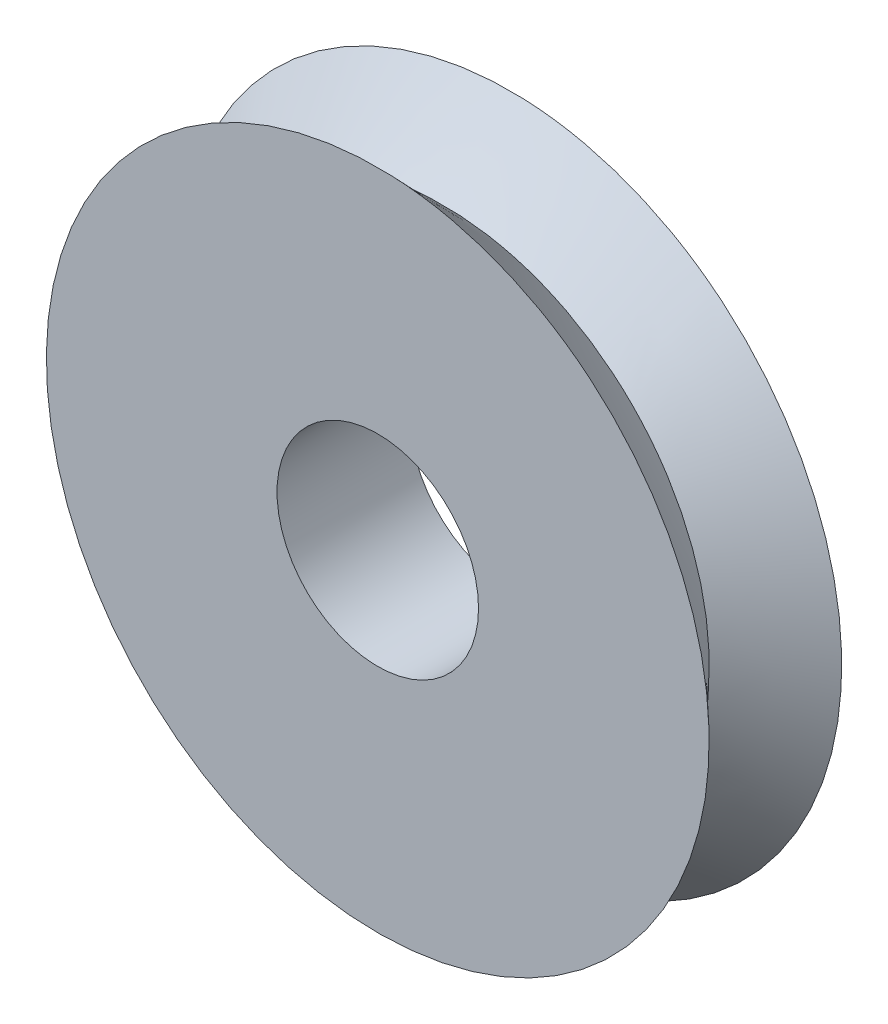
ISO-10303-21;
HEADER;
FILE_DESCRIPTION(('STEP AP214'),'2;1');
FILE_NAME('part.step','',(''),(''),'','','');
FILE_SCHEMA(('AUTOMOTIVE_DESIGN { 1 0 10303 214 1 1 1 1 }'));
ENDSEC;
DATA;
#1=APPLICATION_CONTEXT('core data for automotive mechanical design processes');
#2=APPLICATION_PROTOCOL_DEFINITION('international standard','automotive_design',2000,#1);
#3=PRODUCT_CONTEXT('',#1,'mechanical');
#4=PRODUCT('Part','Part','',(#3));
#5=PRODUCT_RELATED_PRODUCT_CATEGORY('part','',(#4));
#6=PRODUCT_DEFINITION_FORMATION('','',#4);
#7=PRODUCT_DEFINITION_CONTEXT('part definition',#1,'design');
#8=PRODUCT_DEFINITION('design','',#6,#7);
#9=PRODUCT_DEFINITION_SHAPE('','',#8);
#10=(LENGTH_UNIT() NAMED_UNIT(*) SI_UNIT(.MILLI.,.METRE.));
#11=(NAMED_UNIT(*) PLANE_ANGLE_UNIT() SI_UNIT($,.RADIAN.));
#12=(NAMED_UNIT(*) SI_UNIT($,.STERADIAN.) SOLID_ANGLE_UNIT());
#13=UNCERTAINTY_MEASURE_WITH_UNIT(LENGTH_MEASURE(1.E-05),#10,'distance_accuracy_value','');
#14=(GEOMETRIC_REPRESENTATION_CONTEXT(3) GLOBAL_UNCERTAINTY_ASSIGNED_CONTEXT((#13)) GLOBAL_UNIT_ASSIGNED_CONTEXT((#10,
#11,#12)) REPRESENTATION_CONTEXT('',''));
#15=CARTESIAN_POINT('',(0.,0.,0.));
#16=DIRECTION('',(0.,0.,1.));
#17=DIRECTION('',(1.,0.,0.));
#18=AXIS2_PLACEMENT_3D('',#15,#16,#17);
#19=CARTESIAN_POINT('',(0.,0.,1.));
#20=DIRECTION('',(0.,0.,1.));
#21=DIRECTION('',(1.,0.,0.));
#22=AXIS2_PLACEMENT_3D('',#19,#20,#21);
#23=PLANE('',#22);
#24=CARTESIAN_POINT('',(0.,0.,1.));
#25=DIRECTION('',(0.,0.,1.));
#26=DIRECTION('',(1.,0.,0.));
#27=AXIS2_PLACEMENT_3D('',#24,#25,#26);
#28=CIRCLE('',#27,1.52);
#29=CARTESIAN_POINT('',(1.52,0.,1.));
#30=VERTEX_POINT('',#29);
#31=EDGE_CURVE('E56',#30,#30,#28,.T.);
#32=ORIENTED_EDGE('',*,*,#31,.F.);
#33=EDGE_LOOP('',(#32));
#34=FACE_BOUND('',#33,.T.);
#35=CARTESIAN_POINT('',(0.,0.,1.));
#36=DIRECTION('',(0.,0.,1.));
#37=DIRECTION('',(1.,0.,0.));
#38=AXIS2_PLACEMENT_3D('',#35,#36,#37);
#39=CIRCLE('',#38,5.);
#40=CARTESIAN_POINT('',(-1.79672698002946,-4.66602316316949,1.));
#41=VERTEX_POINT('',#40);
#42=EDGE_CURVE('E11',#41,#41,#39,.T.);
#43=ORIENTED_EDGE('',*,*,#42,.T.);
#44=EDGE_LOOP('',(#43));
#45=FACE_BOUND('',#44,.T.);
#46=ADVANCED_FACE('F41',(#34,#45),#23,.T.);
#47=CARTESIAN_POINT('',(-2.20658348251373,-3.33631373445268,0.));
#48=CARTESIAN_POINT('',(-1.79672698002946,-4.66602316316949,1.));
#49=CARTESIAN_POINT('',(4.46604398639164,-7.74948069948013,0.));
#50=CARTESIAN_POINT('',(7.53531934630953,-8.2594771232284,1.));
#51=CARTESIAN_POINT('',(8.87921095141909,-1.07685323057477,0.));
#52=CARTESIAN_POINT('',(11.1287733063684,1.07256920311058,1.));
#53=CARTESIAN_POINT('',(2.20658348251372,3.33631373445268,0.));
#54=CARTESIAN_POINT('',(1.79672698002945,4.66602316316949,1.));
#55=CARTESIAN_POINT('',(-4.46604398639164,7.74948069948013,0.));
#56=CARTESIAN_POINT('',(-7.53531934630953,8.2594771232284,1.));
#57=CARTESIAN_POINT('',(-8.87921095141909,1.07685323057477,0.));
#58=CARTESIAN_POINT('',(-11.1287733063684,-1.07256920311058,1.));
#59=CARTESIAN_POINT('',(-2.20658348251373,-3.33631373445268,0.));
#60=CARTESIAN_POINT('',(-1.79672698002946,-4.66602316316949,1.));
#61=(BOUNDED_SURFACE() B_SPLINE_SURFACE(3,1,((#47,#48),(#49,#50),(#51,#52),(#53,#54),(#55,#56),
(#57,#58),(#59,#60)),.UNSPECIFIED.,.T.,.F.,.F.) B_SPLINE_SURFACE_WITH_KNOTS((4,3,4),(2,2),(0.,
0.5,1.),(0.,1.),.UNSPECIFIED.) GEOMETRIC_REPRESENTATION_ITEM() RATIONAL_B_SPLINE_SURFACE(((1.,
1.),(0.333333333333333,0.333333333333333),(0.333333333333333,0.333333333333333),(1.,1.),
(0.333333333333333,0.333333333333333),(0.333333333333333,0.333333333333333),(1.,1.))) REPRESENTATION_ITEM('') SURFACE());
#62=CARTESIAN_POINT('',(0.,0.,0.));
#63=DIRECTION('',(0.,0.,1.));
#64=DIRECTION('',(1.,0.,0.));
#65=AXIS2_PLACEMENT_3D('',#62,#63,#64);
#66=CIRCLE('',#65,4.);
#67=CARTESIAN_POINT('',(-2.20658348251373,-3.33631373445268,0.));
#68=VERTEX_POINT('',#67);
#69=EDGE_CURVE('E51',#68,#68,#66,.T.);
#70=CARTESIAN_POINT('',(-2.20658348251373,-3.33631373445268,0.));
#71=CARTESIAN_POINT('',(-2.20231414394618,-3.35016487433515,0.0104166666666666));
#72=CARTESIAN_POINT('',(-2.19804480537864,-3.36401601421762,0.0208333333333333));
#73=CARTESIAN_POINT('',(-2.18950612824355,-3.39171829398255,0.0416666666666667));
#74=CARTESIAN_POINT('',(-2.185236789676,-3.40556943386502,0.0520833333333334));
#75=CARTESIAN_POINT('',(-2.17669811254091,-3.43327171362995,0.0729166666666667));
#76=CARTESIAN_POINT('',(-2.17242877397337,-3.44712285351242,0.0833333333333333));
#77=CARTESIAN_POINT('',(-2.16389009683828,-3.47482513327735,0.104166666666667));
#78=CARTESIAN_POINT('',(-2.15962075827074,-3.48867627315982,0.114583333333333));
#79=CARTESIAN_POINT('',(-2.15108208113565,-3.51637855292475,0.135416666666667));
#80=CARTESIAN_POINT('',(-2.1468127425681,-3.53022969280722,0.145833333333333));
#81=CARTESIAN_POINT('',(-2.13827406543301,-3.55793197257215,0.166666666666667));
#82=CARTESIAN_POINT('',(-2.13400472686547,-3.57178311245462,0.177083333333333));
#83=CARTESIAN_POINT('',(-2.12546604973038,-3.59948539221955,0.197916666666667));
#84=CARTESIAN_POINT('',(-2.12119671116284,-3.61333653210202,0.208333333333333));
#85=CARTESIAN_POINT('',(-2.11265803402775,-3.64103881186695,0.229166666666667));
#86=CARTESIAN_POINT('',(-2.1083886954602,-3.65488995174942,0.239583333333333));
#87=CARTESIAN_POINT('',(-2.09985001832511,-3.68259223151435,0.260416666666667));
#88=CARTESIAN_POINT('',(-2.09558067975757,-3.69644337139682,0.270833333333333));
#89=CARTESIAN_POINT('',(-2.08704200262248,-3.72414565116175,0.291666666666667));
#90=CARTESIAN_POINT('',(-2.08277266405494,-3.73799679104422,0.302083333333333));
#91=CARTESIAN_POINT('',(-2.07423398691985,-3.76569907080915,0.322916666666667));
#92=CARTESIAN_POINT('',(-2.0699646483523,-3.77955021069162,0.333333333333333));
#93=CARTESIAN_POINT('',(-2.06142597121721,-3.80725249045655,0.354166666666667));
#94=CARTESIAN_POINT('',(-2.05715663264967,-3.82110363033902,0.364583333333333));
#95=CARTESIAN_POINT('',(-2.04861795551458,-3.84880591010395,0.385416666666667));
#96=CARTESIAN_POINT('',(-2.04434861694704,-3.86265704998642,0.395833333333333));
#97=CARTESIAN_POINT('',(-2.03580993981195,-3.89035932975135,0.416666666666667));
#98=CARTESIAN_POINT('',(-2.0315406012444,-3.90421046963382,0.427083333333333));
#99=CARTESIAN_POINT('',(-2.02300192410931,-3.93191274939875,0.447916666666667));
#100=CARTESIAN_POINT('',(-2.01873258554177,-3.94576388928122,0.458333333333333));
#101=CARTESIAN_POINT('',(-2.01019390840668,-3.97346616904615,0.479166666666667));
#102=CARTESIAN_POINT('',(-2.00592456983913,-3.98731730892862,0.489583333333333));
#103=CARTESIAN_POINT('',(-1.99738589270405,-4.01501958869355,0.510416666666667));
#104=CARTESIAN_POINT('',(-1.9931165541365,-4.02887072857602,0.520833333333333));
#105=CARTESIAN_POINT('',(-1.98457787700141,-4.05657300834095,0.541666666666667));
#106=CARTESIAN_POINT('',(-1.98030853843387,-4.07042414822342,0.552083333333333));
#107=CARTESIAN_POINT('',(-1.97176986129878,-4.09812642798835,0.572916666666667));
#108=CARTESIAN_POINT('',(-1.96750052273123,-4.11197756787082,0.583333333333333));
#109=CARTESIAN_POINT('',(-1.95896184559615,-4.13967984763575,0.604166666666667));
#110=CARTESIAN_POINT('',(-1.9546925070286,-4.15353098751822,0.614583333333333));
#111=CARTESIAN_POINT('',(-1.94615382989351,-4.18123326728316,0.635416666666667));
#112=CARTESIAN_POINT('',(-1.94188449132597,-4.19508440716562,0.645833333333333));
#113=CARTESIAN_POINT('',(-1.93334581419088,-4.22278668693056,0.666666666666667));
#114=CARTESIAN_POINT('',(-1.92907647562333,-4.23663782681302,0.677083333333333));
#115=CARTESIAN_POINT('',(-1.92053779848825,-4.26434010657796,0.697916666666667));
#116=CARTESIAN_POINT('',(-1.9162684599207,-4.27819124646042,0.708333333333333));
#117=CARTESIAN_POINT('',(-1.90772978278561,-4.30589352622536,0.729166666666667));
#118=CARTESIAN_POINT('',(-1.90346044421807,-4.31974466610782,0.739583333333333));
#119=CARTESIAN_POINT('',(-1.89492176708298,-4.34744694587276,0.760416666666667));
#120=CARTESIAN_POINT('',(-1.89065242851543,-4.36129808575522,0.770833333333333));
#121=CARTESIAN_POINT('',(-1.88211375138034,-4.38900036552016,0.791666666666667));
#122=CARTESIAN_POINT('',(-1.8778444128128,-4.40285150540262,0.802083333333333));
#123=CARTESIAN_POINT('',(-1.86930573567771,-4.43055378516756,0.822916666666667));
#124=CARTESIAN_POINT('',(-1.86503639711017,-4.44440492505002,0.833333333333333));
#125=CARTESIAN_POINT('',(-1.85649771997508,-4.47210720481496,0.854166666666667));
#126=CARTESIAN_POINT('',(-1.85222838140753,-4.48595834469742,0.864583333333333));
#127=CARTESIAN_POINT('',(-1.84368970427244,-4.51366062446236,0.885416666666667));
#128=CARTESIAN_POINT('',(-1.8394203657049,-4.52751176434482,0.895833333333333));
#129=CARTESIAN_POINT('',(-1.83088168856981,-4.55521404410976,0.916666666666667));
#130=CARTESIAN_POINT('',(-1.82661235000227,-4.56906518399223,0.927083333333333));
#131=CARTESIAN_POINT('',(-1.81807367286718,-4.59676746375716,0.947916666666667));
#132=CARTESIAN_POINT('',(-1.81380433429963,-4.61061860363963,0.958333333333333));
#133=CARTESIAN_POINT('',(-1.80526565716454,-4.63832088340456,0.979166666666667));
#134=CARTESIAN_POINT('',(-1.800996318597,-4.65217202328702,0.989583333333333));
#135=CARTESIAN_POINT('',(-1.79672698002946,-4.66602316316949,1.));
#136=B_SPLINE_CURVE_WITH_KNOTS('',3,(#70,#71,#72,#73,#74,#75,#76,#77,#78,#79,#80,#81,#82,#83,
#84,#85,#86,#87,#88,#89,#90,#91,#92,#93,#94,#95,#96,#97,#98,#99,#100,#101,#102,#103,#104,#105,
#106,#107,#108,#109,#110,#111,#112,#113,#114,#115,#116,#117,#118,#119,#120,#121,#122,#123,#124,
#125,#126,#127,#128,#129,#130,#131,#132,#133,#134,#135),.UNSPECIFIED.,.F.,.F.,(4,2,2,2,2,2,2,2,
2,2,2,2,2,2,2,2,2,2,2,2,2,2,2,2,2,2,2,2,2,2,2,2,4),(0.,0.0535471236448033,0.107094247289607,
0.16064137093441,0.214188494579213,0.267735618224017,0.32128274186882,0.374829865513623,
0.428376989158427,0.48192411280323,0.535471236448033,0.589018360092837,0.64256548373764,
0.696112607382443,0.749659731027247,0.80320685467205,0.856753978316853,0.910301101961657,
0.96384822560646,1.01739534925126,1.07094247289607,1.12448959654087,1.17803672018567,
1.23158384383048,1.28513096747528,1.33867809112008,1.39222521476489,1.44577233840969,
1.49931946205449,1.5528665856993,1.6064137093441,1.6599608329889,1.71350795663371),.UNSPECIFIED.);
#137=EDGE_CURVE('BSEAM67',#68,#41,#136,.T.);
#138=ORIENTED_EDGE('',*,*,#69,.T.);
#139=ORIENTED_EDGE('',*,*,#42,.F.);
#140=ORIENTED_EDGE('',*,*,#137,.T.);
#141=ORIENTED_EDGE('',*,*,#137,.F.);
#142=EDGE_LOOP('',(#138,#140,#139,#141));
#143=FACE_BOUND('',#142,.T.);
#144=ADVANCED_FACE('F67',(#143),#61,.T.);
#145=CARTESIAN_POINT('',(0.,0.,-1.));
#146=DIRECTION('',(0.,0.,-1.));
#147=DIRECTION('',(1.,0.,0.));
#148=AXIS2_PLACEMENT_3D('',#145,#146,#147);
#149=PLANE('',#148);
#150=CARTESIAN_POINT('',(0.,0.,-1.));
#151=DIRECTION('',(0.,0.,-1.));
#152=DIRECTION('',(-1.,0.,0.));
#153=AXIS2_PLACEMENT_3D('',#150,#151,#152);
#154=CIRCLE('',#153,1.52);
#155=CARTESIAN_POINT('',(-1.52,0.,-1.));
#156=VERTEX_POINT('',#155);
#157=EDGE_CURVE('E58',#156,#156,#154,.F.);
#158=ORIENTED_EDGE('',*,*,#157,.T.);
#159=EDGE_LOOP('',(#158));
#160=FACE_BOUND('',#159,.T.);
#161=CARTESIAN_POINT('',(0.,0.,-1.));
#162=DIRECTION('',(0.,0.,1.));
#163=DIRECTION('',(1.,0.,0.));
#164=AXIS2_PLACEMENT_3D('',#161,#162,#163);
#165=CIRCLE('',#164,5.);
#166=CARTESIAN_POINT('',(-1.79672698002946,-4.66602316316949,-1.));
#167=VERTEX_POINT('',#166);
#168=EDGE_CURVE('E47',#167,#167,#165,.T.);
#169=ORIENTED_EDGE('',*,*,#168,.F.);
#170=EDGE_LOOP('',(#169));
#171=FACE_BOUND('',#170,.T.);
#172=ADVANCED_FACE('F73',(#160,#171),#149,.T.);
#173=CARTESIAN_POINT('',(-2.20658348251373,-3.33631373445268,0.));
#174=CARTESIAN_POINT('',(-1.79672698002946,-4.66602316316949,-1.));
#175=CARTESIAN_POINT('',(4.46604398639164,-7.74948069948013,0.));
#176=CARTESIAN_POINT('',(7.53531934630953,-8.2594771232284,-1.));
#177=CARTESIAN_POINT('',(8.87921095141909,-1.07685323057477,0.));
#178=CARTESIAN_POINT('',(11.1287733063684,1.07256920311058,-1.));
#179=CARTESIAN_POINT('',(2.20658348251372,3.33631373445268,0.));
#180=CARTESIAN_POINT('',(1.79672698002945,4.66602316316949,-1.));
#181=CARTESIAN_POINT('',(-4.46604398639164,7.74948069948013,0.));
#182=CARTESIAN_POINT('',(-7.53531934630953,8.2594771232284,-1.));
#183=CARTESIAN_POINT('',(-8.87921095141909,1.07685323057477,0.));
#184=CARTESIAN_POINT('',(-11.1287733063684,-1.07256920311058,-1.));
#185=CARTESIAN_POINT('',(-2.20658348251373,-3.33631373445268,0.));
#186=CARTESIAN_POINT('',(-1.79672698002946,-4.66602316316949,-1.));
#187=(BOUNDED_SURFACE() B_SPLINE_SURFACE(3,1,((#173,#174),(#175,#176),(#177,#178),(#179,#180),
(#181,#182),(#183,#184),(#185,#186)),.UNSPECIFIED.,.T.,.F.,.F.) B_SPLINE_SURFACE_WITH_KNOTS((4,
3,4),(2,2),(0.,0.5,1.),(0.,1.),
.UNSPECIFIED.) GEOMETRIC_REPRESENTATION_ITEM() RATIONAL_B_SPLINE_SURFACE(((1.,1.),
(0.333333333333333,0.333333333333333),(0.333333333333333,0.333333333333333),(1.,1.),
(0.333333333333333,0.333333333333333),(0.333333333333333,0.333333333333333),(1.,1.))) REPRESENTATION_ITEM('') SURFACE());
#188=CARTESIAN_POINT('',(-2.20658348251373,-3.33631373445268,0.));
#189=CARTESIAN_POINT('',(-2.20231414394618,-3.35016487433515,-0.0104166666666666));
#190=CARTESIAN_POINT('',(-2.19804480537864,-3.36401601421762,-0.0208333333333333));
#191=CARTESIAN_POINT('',(-2.18950612824355,-3.39171829398255,-0.0416666666666667));
#192=CARTESIAN_POINT('',(-2.185236789676,-3.40556943386502,-0.0520833333333334));
#193=CARTESIAN_POINT('',(-2.17669811254091,-3.43327171362995,-0.0729166666666667));
#194=CARTESIAN_POINT('',(-2.17242877397337,-3.44712285351242,-0.0833333333333333));
#195=CARTESIAN_POINT('',(-2.16389009683828,-3.47482513327735,-0.104166666666667));
#196=CARTESIAN_POINT('',(-2.15962075827074,-3.48867627315982,-0.114583333333333));
#197=CARTESIAN_POINT('',(-2.15108208113565,-3.51637855292475,-0.135416666666667));
#198=CARTESIAN_POINT('',(-2.1468127425681,-3.53022969280722,-0.145833333333333));
#199=CARTESIAN_POINT('',(-2.13827406543301,-3.55793197257215,-0.166666666666667));
#200=CARTESIAN_POINT('',(-2.13400472686547,-3.57178311245462,-0.177083333333333));
#201=CARTESIAN_POINT('',(-2.12546604973038,-3.59948539221955,-0.197916666666667));
#202=CARTESIAN_POINT('',(-2.12119671116284,-3.61333653210202,-0.208333333333333));
#203=CARTESIAN_POINT('',(-2.11265803402775,-3.64103881186695,-0.229166666666667));
#204=CARTESIAN_POINT('',(-2.1083886954602,-3.65488995174942,-0.239583333333333));
#205=CARTESIAN_POINT('',(-2.09985001832511,-3.68259223151435,-0.260416666666667));
#206=CARTESIAN_POINT('',(-2.09558067975757,-3.69644337139682,-0.270833333333333));
#207=CARTESIAN_POINT('',(-2.08704200262248,-3.72414565116175,-0.291666666666667));
#208=CARTESIAN_POINT('',(-2.08277266405494,-3.73799679104422,-0.302083333333333));
#209=CARTESIAN_POINT('',(-2.07423398691985,-3.76569907080915,-0.322916666666667));
#210=CARTESIAN_POINT('',(-2.0699646483523,-3.77955021069162,-0.333333333333333));
#211=CARTESIAN_POINT('',(-2.06142597121721,-3.80725249045655,-0.354166666666667));
#212=CARTESIAN_POINT('',(-2.05715663264967,-3.82110363033902,-0.364583333333333));
#213=CARTESIAN_POINT('',(-2.04861795551458,-3.84880591010395,-0.385416666666667));
#214=CARTESIAN_POINT('',(-2.04434861694704,-3.86265704998642,-0.395833333333333));
#215=CARTESIAN_POINT('',(-2.03580993981195,-3.89035932975135,-0.416666666666667));
#216=CARTESIAN_POINT('',(-2.0315406012444,-3.90421046963382,-0.427083333333333));
#217=CARTESIAN_POINT('',(-2.02300192410931,-3.93191274939875,-0.447916666666667));
#218=CARTESIAN_POINT('',(-2.01873258554177,-3.94576388928122,-0.458333333333333));
#219=CARTESIAN_POINT('',(-2.01019390840668,-3.97346616904615,-0.479166666666667));
#220=CARTESIAN_POINT('',(-2.00592456983913,-3.98731730892862,-0.489583333333333));
#221=CARTESIAN_POINT('',(-1.99738589270405,-4.01501958869355,-0.510416666666667));
#222=CARTESIAN_POINT('',(-1.9931165541365,-4.02887072857602,-0.520833333333333));
#223=CARTESIAN_POINT('',(-1.98457787700141,-4.05657300834095,-0.541666666666667));
#224=CARTESIAN_POINT('',(-1.98030853843387,-4.07042414822342,-0.552083333333333));
#225=CARTESIAN_POINT('',(-1.97176986129878,-4.09812642798835,-0.572916666666667));
#226=CARTESIAN_POINT('',(-1.96750052273123,-4.11197756787082,-0.583333333333333));
#227=CARTESIAN_POINT('',(-1.95896184559615,-4.13967984763575,-0.604166666666667));
#228=CARTESIAN_POINT('',(-1.9546925070286,-4.15353098751822,-0.614583333333333));
#229=CARTESIAN_POINT('',(-1.94615382989351,-4.18123326728316,-0.635416666666667));
#230=CARTESIAN_POINT('',(-1.94188449132597,-4.19508440716562,-0.645833333333333));
#231=CARTESIAN_POINT('',(-1.93334581419088,-4.22278668693056,-0.666666666666667));
#232=CARTESIAN_POINT('',(-1.92907647562333,-4.23663782681302,-0.677083333333333));
#233=CARTESIAN_POINT('',(-1.92053779848825,-4.26434010657796,-0.697916666666667));
#234=CARTESIAN_POINT('',(-1.9162684599207,-4.27819124646042,-0.708333333333333));
#235=CARTESIAN_POINT('',(-1.90772978278561,-4.30589352622536,-0.729166666666667));
#236=CARTESIAN_POINT('',(-1.90346044421807,-4.31974466610782,-0.739583333333333));
#237=CARTESIAN_POINT('',(-1.89492176708298,-4.34744694587276,-0.760416666666667));
#238=CARTESIAN_POINT('',(-1.89065242851543,-4.36129808575522,-0.770833333333333));
#239=CARTESIAN_POINT('',(-1.88211375138034,-4.38900036552016,-0.791666666666667));
#240=CARTESIAN_POINT('',(-1.8778444128128,-4.40285150540262,-0.802083333333333));
#241=CARTESIAN_POINT('',(-1.86930573567771,-4.43055378516756,-0.822916666666667));
#242=CARTESIAN_POINT('',(-1.86503639711017,-4.44440492505002,-0.833333333333333));
#243=CARTESIAN_POINT('',(-1.85649771997508,-4.47210720481496,-0.854166666666667));
#244=CARTESIAN_POINT('',(-1.85222838140753,-4.48595834469742,-0.864583333333333));
#245=CARTESIAN_POINT('',(-1.84368970427244,-4.51366062446236,-0.885416666666667));
#246=CARTESIAN_POINT('',(-1.8394203657049,-4.52751176434482,-0.895833333333333));
#247=CARTESIAN_POINT('',(-1.83088168856981,-4.55521404410976,-0.916666666666667));
#248=CARTESIAN_POINT('',(-1.82661235000227,-4.56906518399223,-0.927083333333333));
#249=CARTESIAN_POINT('',(-1.81807367286718,-4.59676746375716,-0.947916666666667));
#250=CARTESIAN_POINT('',(-1.81380433429963,-4.61061860363963,-0.958333333333333));
#251=CARTESIAN_POINT('',(-1.80526565716454,-4.63832088340456,-0.979166666666667));
#252=CARTESIAN_POINT('',(-1.800996318597,-4.65217202328702,-0.989583333333333));
#253=CARTESIAN_POINT('',(-1.79672698002946,-4.66602316316949,-1.));
#254=B_SPLINE_CURVE_WITH_KNOTS('',3,(#188,#189,#190,#191,#192,#193,#194,#195,#196,#197,#198,
#199,#200,#201,#202,#203,#204,#205,#206,#207,#208,#209,#210,#211,#212,#213,#214,#215,#216,#217,
#218,#219,#220,#221,#222,#223,#224,#225,#226,#227,#228,#229,#230,#231,#232,#233,#234,#235,#236,
#237,#238,#239,#240,#241,#242,#243,#244,#245,#246,#247,#248,#249,#250,#251,#252,#253),
.UNSPECIFIED.,.F.,.F.,(4,2,2,2,2,2,2,2,2,2,2,2,2,2,2,2,2,2,2,2,2,2,2,2,2,2,2,2,2,2,2,2,4),(0.,
0.0535471236448033,0.107094247289607,0.16064137093441,0.214188494579213,0.267735618224017,
0.32128274186882,0.374829865513623,0.428376989158427,0.48192411280323,0.535471236448033,
0.589018360092837,0.64256548373764,0.696112607382443,0.749659731027247,0.80320685467205,
0.856753978316853,0.910301101961657,0.96384822560646,1.01739534925126,1.07094247289607,
1.12448959654087,1.17803672018567,1.23158384383048,1.28513096747528,1.33867809112008,
1.39222521476489,1.44577233840969,1.49931946205449,1.5528665856993,1.6064137093441,
1.6599608329889,1.71350795663371),.UNSPECIFIED.);
#255=EDGE_CURVE('BSEAM77',#68,#167,#254,.T.);
#256=ORIENTED_EDGE('',*,*,#69,.F.);
#257=ORIENTED_EDGE('',*,*,#168,.T.);
#258=ORIENTED_EDGE('',*,*,#255,.T.);
#259=ORIENTED_EDGE('',*,*,#255,.F.);
#260=EDGE_LOOP('',(#256,#258,#257,#259));
#261=FACE_BOUND('',#260,.T.);
#262=ADVANCED_FACE('F77',(#261),#187,.F.);
#263=CARTESIAN_POINT('',(0.,0.,-1.001));
#264=DIRECTION('',(0.,0.,1.));
#265=DIRECTION('',(1.,0.,0.));
#266=AXIS2_PLACEMENT_3D('',#263,#264,#265);
#267=CYLINDRICAL_SURFACE('',#266,1.52);
#268=ORIENTED_EDGE('',*,*,#157,.F.);
#269=EDGE_LOOP('',(#268));
#270=FACE_BOUND('',#269,.T.);
#271=ORIENTED_EDGE('',*,*,#31,.T.);
#272=EDGE_LOOP('',(#271));
#273=FACE_BOUND('',#272,.T.);
#274=ADVANCED_FACE('F64',(#270,#273),#267,.F.);
#275=CLOSED_SHELL('',(#46,#144,#172,#262,#274));
#276=MANIFOLD_SOLID_BREP('B2',#275);
#277=ADVANCED_BREP_SHAPE_REPRESENTATION('',(#18,#276),#14);
#278=SHAPE_DEFINITION_REPRESENTATION(#9,#277);
ENDSEC;
END-ISO-10303-21;
